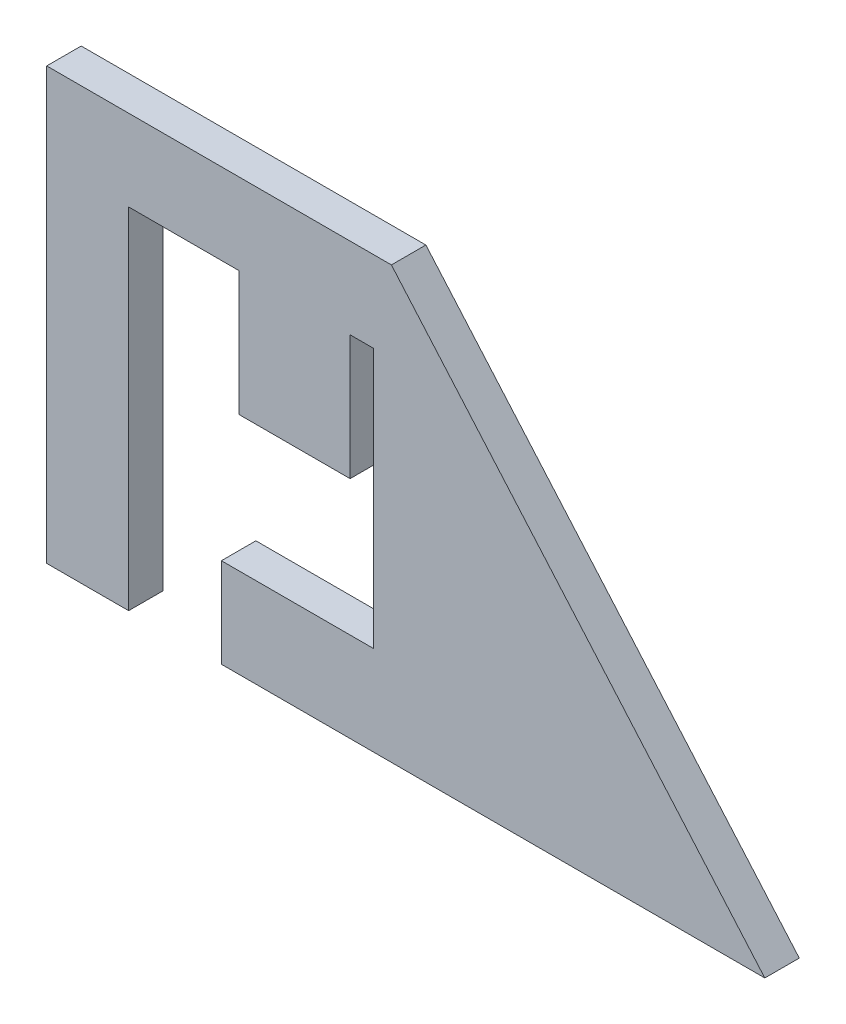
ISO-10303-21;
HEADER;
FILE_DESCRIPTION(('STEP AP214'),'2;1');
FILE_NAME('part.step','',(''),(''),'','','');
FILE_SCHEMA(('AUTOMOTIVE_DESIGN { 1 0 10303 214 1 1 1 1 }'));
ENDSEC;
DATA;
#1=APPLICATION_CONTEXT('core data for automotive mechanical design processes');
#2=APPLICATION_PROTOCOL_DEFINITION('international standard','automotive_design',2000,#1);
#3=PRODUCT_CONTEXT('',#1,'mechanical');
#4=PRODUCT('Part','Part','',(#3));
#5=PRODUCT_RELATED_PRODUCT_CATEGORY('part','',(#4));
#6=PRODUCT_DEFINITION_FORMATION('','',#4);
#7=PRODUCT_DEFINITION_CONTEXT('part definition',#1,'design');
#8=PRODUCT_DEFINITION('design','',#6,#7);
#9=PRODUCT_DEFINITION_SHAPE('','',#8);
#10=(LENGTH_UNIT() NAMED_UNIT(*) SI_UNIT(.MILLI.,.METRE.));
#11=(NAMED_UNIT(*) PLANE_ANGLE_UNIT() SI_UNIT($,.RADIAN.));
#12=(NAMED_UNIT(*) SI_UNIT($,.STERADIAN.) SOLID_ANGLE_UNIT());
#13=UNCERTAINTY_MEASURE_WITH_UNIT(LENGTH_MEASURE(1.E-05),#10,'distance_accuracy_value','');
#14=(GEOMETRIC_REPRESENTATION_CONTEXT(3) GLOBAL_UNCERTAINTY_ASSIGNED_CONTEXT((#13)) GLOBAL_UNIT_ASSIGNED_CONTEXT((#10,
#11,#12)) REPRESENTATION_CONTEXT('',''));
#15=CARTESIAN_POINT('',(0.,0.,0.));
#16=DIRECTION('',(0.,0.,1.));
#17=DIRECTION('',(1.,0.,0.));
#18=AXIS2_PLACEMENT_3D('',#15,#16,#17);
#19=CARTESIAN_POINT('',(0.,0.,6.));
#20=DIRECTION('',(0.,1.,0.));
#21=DIRECTION('',(0.,0.,1.));
#22=AXIS2_PLACEMENT_3D('',#19,#20,#21);
#23=PLANE('',#22);
#24=DIRECTION('',(1.,0.,0.));
#25=VECTOR('',#24,1.);
#26=CARTESIAN_POINT('',(0.,0.,6.));
#27=LINE('',#26,#25);
#28=CARTESIAN_POINT('',(60.8165102830287,0.,6.));
#29=VERTEX_POINT('',#28);
#30=CARTESIAN_POINT('',(250.,0.,6.));
#31=VERTEX_POINT('',#30);
#32=EDGE_CURVE('E232',#29,#31,#27,.T.);
#33=ORIENTED_EDGE('',*,*,#32,.F.);
#34=DIRECTION('',(0.,0.,1.));
#35=VECTOR('',#34,1.);
#36=CARTESIAN_POINT('',(60.8165102830287,0.,-6.));
#37=LINE('',#36,#35);
#38=CARTESIAN_POINT('',(60.8165102830287,0.,-6.));
#39=VERTEX_POINT('',#38);
#40=EDGE_CURVE('E216',#39,#29,#37,.T.);
#41=ORIENTED_EDGE('',*,*,#40,.F.);
#42=DIRECTION('',(1.,0.,0.));
#43=VECTOR('',#42,1.);
#44=CARTESIAN_POINT('',(0.,0.,-6.));
#45=LINE('',#44,#43);
#46=CARTESIAN_POINT('',(250.,0.,-6.));
#47=VERTEX_POINT('',#46);
#48=EDGE_CURVE('E221',#39,#47,#45,.T.);
#49=ORIENTED_EDGE('',*,*,#48,.T.);
#50=DIRECTION('',(0.,0.,-1.));
#51=VECTOR('',#50,1.);
#52=CARTESIAN_POINT('',(250.,0.,6.));
#53=LINE('',#52,#51);
#54=EDGE_CURVE('E43',#31,#47,#53,.T.);
#55=ORIENTED_EDGE('',*,*,#54,.F.);
#56=EDGE_LOOP('',(#33,#41,#49,#55));
#57=FACE_BOUND('',#56,.T.);
#58=ADVANCED_FACE('F35',(#57),#23,.F.);
#59=CARTESIAN_POINT('',(0.,150.,6.));
#60=DIRECTION('',(1.,0.,0.));
#61=DIRECTION('',(0.,1.,0.));
#62=AXIS2_PLACEMENT_3D('',#59,#60,#61);
#63=PLANE('',#62);
#64=DIRECTION('',(0.,0.,-1.));
#65=VECTOR('',#64,1.);
#66=CARTESIAN_POINT('',(0.,150.,6.));
#67=LINE('',#66,#65);
#68=CARTESIAN_POINT('',(0.,150.,6.));
#69=VERTEX_POINT('',#68);
#70=CARTESIAN_POINT('',(0.,150.,-6.));
#71=VERTEX_POINT('',#70);
#72=EDGE_CURVE('E239',#69,#71,#67,.T.);
#73=ORIENTED_EDGE('',*,*,#72,.T.);
#74=DIRECTION('',(0.,-1.,0.));
#75=VECTOR('',#74,1.);
#76=CARTESIAN_POINT('',(0.,150.,-6.));
#77=LINE('',#76,#75);
#78=CARTESIAN_POINT('',(0.,0.,-6.));
#79=VERTEX_POINT('',#78);
#80=EDGE_CURVE('E203',#71,#79,#77,.T.);
#81=ORIENTED_EDGE('',*,*,#80,.T.);
#82=DIRECTION('',(0.,0.,-1.));
#83=VECTOR('',#82,1.);
#84=CARTESIAN_POINT('',(0.,0.,6.));
#85=LINE('',#84,#83);
#86=CARTESIAN_POINT('',(0.,0.,6.));
#87=VERTEX_POINT('',#86);
#88=EDGE_CURVE('E11',#87,#79,#85,.T.);
#89=ORIENTED_EDGE('',*,*,#88,.F.);
#90=DIRECTION('',(0.,-1.,0.));
#91=VECTOR('',#90,1.);
#92=CARTESIAN_POINT('',(0.,150.,6.));
#93=LINE('',#92,#91);
#94=EDGE_CURVE('E230',#69,#87,#93,.T.);
#95=ORIENTED_EDGE('',*,*,#94,.F.);
#96=EDGE_LOOP('',(#73,#81,#89,#95));
#97=FACE_BOUND('',#96,.T.);
#98=ADVANCED_FACE('F37',(#97),#63,.F.);
#99=CARTESIAN_POINT('',(28.5158073225923,0.,-6.));
#100=VERTEX_POINT('',#99);
#101=EDGE_CURVE('E222',#79,#100,#45,.T.);
#102=ORIENTED_EDGE('',*,*,#101,.T.);
#103=DIRECTION('',(0.,0.,1.));
#104=VECTOR('',#103,1.);
#105=CARTESIAN_POINT('',(28.5158073225923,0.,-6.));
#106=LINE('',#105,#104);
#107=CARTESIAN_POINT('',(28.5158073225923,0.,6.));
#108=VERTEX_POINT('',#107);
#109=EDGE_CURVE('E50',#100,#108,#106,.T.);
#110=ORIENTED_EDGE('',*,*,#109,.T.);
#111=EDGE_CURVE('E233',#87,#108,#27,.T.);
#112=ORIENTED_EDGE('',*,*,#111,.F.);
#113=ORIENTED_EDGE('',*,*,#88,.T.);
#114=EDGE_LOOP('',(#102,#110,#112,#113));
#115=FACE_BOUND('',#114,.T.);
#116=ADVANCED_FACE('F261',(#115),#23,.F.);
#117=CARTESIAN_POINT('',(250.,0.,6.));
#118=DIRECTION('',(-0.755689082789817,-0.654930538417842,0.));
#119=DIRECTION('',(0.654930538417842,-0.755689082789818,0.));
#120=AXIS2_PLACEMENT_3D('',#117,#118,#119);
#121=PLANE('',#120);
#122=ORIENTED_EDGE('',*,*,#54,.T.);
#123=DIRECTION('',(-0.654930538417842,0.755689082789818,0.));
#124=VECTOR('',#123,1.);
#125=CARTESIAN_POINT('',(250.,0.,-6.));
#126=LINE('',#125,#124);
#127=CARTESIAN_POINT('',(120.,150.,-6.));
#128=VERTEX_POINT('',#127);
#129=EDGE_CURVE('E224',#47,#128,#126,.T.);
#130=ORIENTED_EDGE('',*,*,#129,.T.);
#131=DIRECTION('',(0.,0.,-1.));
#132=VECTOR('',#131,1.);
#133=CARTESIAN_POINT('',(120.,150.,6.));
#134=LINE('',#133,#132);
#135=CARTESIAN_POINT('',(120.,150.,6.));
#136=VERTEX_POINT('',#135);
#137=EDGE_CURVE('E241',#136,#128,#134,.T.);
#138=ORIENTED_EDGE('',*,*,#137,.F.);
#139=DIRECTION('',(-0.654930538417842,0.755689082789818,0.));
#140=VECTOR('',#139,1.);
#141=CARTESIAN_POINT('',(250.,0.,6.));
#142=LINE('',#141,#140);
#143=EDGE_CURVE('E236',#31,#136,#142,.T.);
#144=ORIENTED_EDGE('',*,*,#143,.F.);
#145=EDGE_LOOP('',(#122,#130,#138,#144));
#146=FACE_BOUND('',#145,.T.);
#147=ADVANCED_FACE('F247',(#146),#121,.F.);
#148=CARTESIAN_POINT('',(120.,150.,6.));
#149=DIRECTION('',(0.,-1.,0.));
#150=DIRECTION('',(1.,0.,0.));
#151=AXIS2_PLACEMENT_3D('',#148,#149,#150);
#152=PLANE('',#151);
#153=ORIENTED_EDGE('',*,*,#137,.T.);
#154=DIRECTION('',(-1.,0.,0.));
#155=VECTOR('',#154,1.);
#156=CARTESIAN_POINT('',(120.,150.,-6.));
#157=LINE('',#156,#155);
#158=EDGE_CURVE('E227',#128,#71,#157,.T.);
#159=ORIENTED_EDGE('',*,*,#158,.T.);
#160=ORIENTED_EDGE('',*,*,#72,.F.);
#161=DIRECTION('',(-1.,0.,0.));
#162=VECTOR('',#161,1.);
#163=CARTESIAN_POINT('',(120.,150.,6.));
#164=LINE('',#163,#162);
#165=EDGE_CURVE('E58',#136,#69,#164,.T.);
#166=ORIENTED_EDGE('',*,*,#165,.F.);
#167=EDGE_LOOP('',(#153,#159,#160,#166));
#168=FACE_BOUND('',#167,.T.);
#169=ADVANCED_FACE('F254',(#168),#152,.F.);
#170=CARTESIAN_POINT('',(0.,0.,6.));
#171=DIRECTION('',(0.,0.,1.));
#172=DIRECTION('',(1.,0.,0.));
#173=AXIS2_PLACEMENT_3D('',#170,#171,#172);
#174=PLANE('',#173);
#175=DIRECTION('',(0.,1.,0.));
#176=VECTOR('',#175,1.);
#177=CARTESIAN_POINT('',(60.8165102830287,31.2245087549701,6.));
#178=LINE('',#177,#176);
#179=CARTESIAN_POINT('',(60.8165102830287,31.2245087549701,6.));
#180=VERTEX_POINT('',#179);
#181=EDGE_CURVE('E184',#29,#180,#178,.T.);
#182=ORIENTED_EDGE('',*,*,#181,.F.);
#183=ORIENTED_EDGE('',*,*,#32,.T.);
#184=ORIENTED_EDGE('',*,*,#143,.T.);
#185=ORIENTED_EDGE('',*,*,#165,.T.);
#186=ORIENTED_EDGE('',*,*,#94,.T.);
#187=ORIENTED_EDGE('',*,*,#111,.T.);
#188=DIRECTION('',(0.,-1.,0.));
#189=VECTOR('',#188,1.);
#190=CARTESIAN_POINT('',(28.5158073225923,0.,6.));
#191=LINE('',#190,#189);
#192=CARTESIAN_POINT('',(28.5158073225923,121.742691755025,6.));
#193=VERTEX_POINT('',#192);
#194=EDGE_CURVE('E182',#193,#108,#191,.T.);
#195=ORIENTED_EDGE('',*,*,#194,.F.);
#196=DIRECTION('',(-1.,0.,0.));
#197=VECTOR('',#196,1.);
#198=CARTESIAN_POINT('',(28.5158073225923,121.742691755025,6.));
#199=LINE('',#198,#197);
#200=CARTESIAN_POINT('',(67.0124310238046,121.742691755025,6.));
#201=VERTEX_POINT('',#200);
#202=EDGE_CURVE('E143',#201,#193,#199,.T.);
#203=ORIENTED_EDGE('',*,*,#202,.F.);
#204=DIRECTION('',(0.,1.,0.));
#205=VECTOR('',#204,1.);
#206=CARTESIAN_POINT('',(67.0124310238046,121.742691755025,6.));
#207=LINE('',#206,#205);
#208=CARTESIAN_POINT('',(67.0124310238046,78.3646518797329,6.));
#209=VERTEX_POINT('',#208);
#210=EDGE_CURVE('E158',#209,#201,#207,.T.);
#211=ORIENTED_EDGE('',*,*,#210,.F.);
#212=DIRECTION('',(-1.,0.,0.));
#213=VECTOR('',#212,1.);
#214=CARTESIAN_POINT('',(67.0124310238046,78.3646518797329,6.));
#215=LINE('',#214,#213);
#216=CARTESIAN_POINT('',(105.623269970229,78.3646518797329,6.));
#217=VERTEX_POINT('',#216);
#218=EDGE_CURVE('E161',#217,#209,#215,.T.);
#219=ORIENTED_EDGE('',*,*,#218,.F.);
#220=DIRECTION('',(0.,-1.,0.));
#221=VECTOR('',#220,1.);
#222=CARTESIAN_POINT('',(105.623269970229,78.3646518797329,6.));
#223=LINE('',#222,#221);
#224=CARTESIAN_POINT('',(105.623269970229,121.742691755025,6.));
#225=VERTEX_POINT('',#224);
#226=EDGE_CURVE('E196',#225,#217,#223,.T.);
#227=ORIENTED_EDGE('',*,*,#226,.F.);
#228=DIRECTION('',(-1.,0.,0.));
#229=VECTOR('',#228,1.);
#230=CARTESIAN_POINT('',(105.623269970229,121.742691755025,6.));
#231=LINE('',#230,#229);
#232=CARTESIAN_POINT('',(113.724056309674,121.742691755025,6.));
#233=VERTEX_POINT('',#232);
#234=EDGE_CURVE('E193',#233,#225,#231,.T.);
#235=ORIENTED_EDGE('',*,*,#234,.F.);
#236=DIRECTION('',(0.,1.,0.));
#237=VECTOR('',#236,1.);
#238=CARTESIAN_POINT('',(113.724056309674,121.742691755025,6.));
#239=LINE('',#238,#237);
#240=CARTESIAN_POINT('',(113.724056309674,31.2245087549701,6.));
#241=VERTEX_POINT('',#240);
#242=EDGE_CURVE('E190',#241,#233,#239,.T.);
#243=ORIENTED_EDGE('',*,*,#242,.F.);
#244=DIRECTION('',(1.,0.,0.));
#245=VECTOR('',#244,1.);
#246=CARTESIAN_POINT('',(113.724056309674,31.2245087549701,6.));
#247=LINE('',#246,#245);
#248=EDGE_CURVE('E187',#180,#241,#247,.T.);
#249=ORIENTED_EDGE('',*,*,#248,.F.);
#250=EDGE_LOOP('',(#182,#183,#184,#185,#186,#187,#195,#203,#211,#219,#227,#235,#243,#249));
#251=FACE_BOUND('',#250,.T.);
#252=ADVANCED_FACE('F259',(#251),#174,.T.);
#253=CARTESIAN_POINT('',(0.,0.,-6.));
#254=DIRECTION('',(0.,0.,1.));
#255=DIRECTION('',(1.,0.,0.));
#256=AXIS2_PLACEMENT_3D('',#253,#254,#255);
#257=PLANE('',#256);
#258=ORIENTED_EDGE('',*,*,#48,.F.);
#259=DIRECTION('',(0.,1.,0.));
#260=VECTOR('',#259,1.);
#261=CARTESIAN_POINT('',(60.8165102830287,31.2245087549701,-6.));
#262=LINE('',#261,#260);
#263=CARTESIAN_POINT('',(60.8165102830287,31.2245087549701,-6.));
#264=VERTEX_POINT('',#263);
#265=EDGE_CURVE('E152',#39,#264,#262,.T.);
#266=ORIENTED_EDGE('',*,*,#265,.T.);
#267=DIRECTION('',(1.,0.,0.));
#268=VECTOR('',#267,1.);
#269=CARTESIAN_POINT('',(113.724056309674,31.2245087549701,-6.));
#270=LINE('',#269,#268);
#271=CARTESIAN_POINT('',(113.724056309674,31.2245087549701,-6.));
#272=VERTEX_POINT('',#271);
#273=EDGE_CURVE('E166',#264,#272,#270,.T.);
#274=ORIENTED_EDGE('',*,*,#273,.T.);
#275=DIRECTION('',(0.,1.,0.));
#276=VECTOR('',#275,1.);
#277=CARTESIAN_POINT('',(113.724056309674,121.742691755025,-6.));
#278=LINE('',#277,#276);
#279=CARTESIAN_POINT('',(113.724056309674,121.742691755025,-6.));
#280=VERTEX_POINT('',#279);
#281=EDGE_CURVE('E169',#272,#280,#278,.T.);
#282=ORIENTED_EDGE('',*,*,#281,.T.);
#283=DIRECTION('',(-1.,0.,0.));
#284=VECTOR('',#283,1.);
#285=CARTESIAN_POINT('',(105.623269970229,121.742691755025,-6.));
#286=LINE('',#285,#284);
#287=CARTESIAN_POINT('',(105.623269970229,121.742691755025,-6.));
#288=VERTEX_POINT('',#287);
#289=EDGE_CURVE('E172',#280,#288,#286,.T.);
#290=ORIENTED_EDGE('',*,*,#289,.T.);
#291=DIRECTION('',(0.,-1.,0.));
#292=VECTOR('',#291,1.);
#293=CARTESIAN_POINT('',(105.623269970229,78.3646518797329,-6.));
#294=LINE('',#293,#292);
#295=CARTESIAN_POINT('',(105.623269970229,78.3646518797329,-6.));
#296=VERTEX_POINT('',#295);
#297=EDGE_CURVE('E175',#288,#296,#294,.T.);
#298=ORIENTED_EDGE('',*,*,#297,.T.);
#299=DIRECTION('',(-1.,0.,0.));
#300=VECTOR('',#299,1.);
#301=CARTESIAN_POINT('',(67.0124310238046,78.3646518797329,-6.));
#302=LINE('',#301,#300);
#303=CARTESIAN_POINT('',(67.0124310238046,78.3646518797329,-6.));
#304=VERTEX_POINT('',#303);
#305=EDGE_CURVE('E178',#296,#304,#302,.T.);
#306=ORIENTED_EDGE('',*,*,#305,.T.);
#307=DIRECTION('',(0.,1.,0.));
#308=VECTOR('',#307,1.);
#309=CARTESIAN_POINT('',(67.0124310238046,121.742691755025,-6.));
#310=LINE('',#309,#308);
#311=CARTESIAN_POINT('',(67.0124310238046,121.742691755025,-6.));
#312=VERTEX_POINT('',#311);
#313=EDGE_CURVE('E145',#304,#312,#310,.T.);
#314=ORIENTED_EDGE('',*,*,#313,.T.);
#315=DIRECTION('',(-1.,0.,0.));
#316=VECTOR('',#315,1.);
#317=CARTESIAN_POINT('',(28.5158073225923,121.742691755025,-6.));
#318=LINE('',#317,#316);
#319=CARTESIAN_POINT('',(28.5158073225923,121.742691755025,-6.));
#320=VERTEX_POINT('',#319);
#321=EDGE_CURVE('E140',#312,#320,#318,.T.);
#322=ORIENTED_EDGE('',*,*,#321,.T.);
#323=DIRECTION('',(0.,-1.,0.));
#324=VECTOR('',#323,1.);
#325=CARTESIAN_POINT('',(28.5158073225923,0.,-6.));
#326=LINE('',#325,#324);
#327=EDGE_CURVE('E147',#320,#100,#326,.T.);
#328=ORIENTED_EDGE('',*,*,#327,.T.);
#329=ORIENTED_EDGE('',*,*,#101,.F.);
#330=ORIENTED_EDGE('',*,*,#80,.F.);
#331=ORIENTED_EDGE('',*,*,#158,.F.);
#332=ORIENTED_EDGE('',*,*,#129,.F.);
#333=EDGE_LOOP('',(#258,#266,#274,#282,#290,#298,#306,#314,#322,#328,#329,#330,#331,#332));
#334=FACE_BOUND('',#333,.T.);
#335=ADVANCED_FACE('F155',(#334),#257,.F.);
#336=CARTESIAN_POINT('',(28.5158073225923,121.742691755025,-6.));
#337=DIRECTION('',(0.,1.,0.));
#338=DIRECTION('',(0.,0.,1.));
#339=AXIS2_PLACEMENT_3D('',#336,#337,#338);
#340=PLANE('',#339);
#341=ORIENTED_EDGE('',*,*,#202,.T.);
#342=DIRECTION('',(0.,0.,1.));
#343=VECTOR('',#342,1.);
#344=CARTESIAN_POINT('',(28.5158073225923,121.742691755025,-6.));
#345=LINE('',#344,#343);
#346=EDGE_CURVE('E137',#320,#193,#345,.T.);
#347=ORIENTED_EDGE('',*,*,#346,.F.);
#348=ORIENTED_EDGE('',*,*,#321,.F.);
#349=DIRECTION('',(0.,0.,1.));
#350=VECTOR('',#349,1.);
#351=CARTESIAN_POINT('',(67.0124310238046,121.742691755025,-6.));
#352=LINE('',#351,#350);
#353=EDGE_CURVE('E201',#312,#201,#352,.T.);
#354=ORIENTED_EDGE('',*,*,#353,.T.);
#355=EDGE_LOOP('',(#341,#347,#348,#354));
#356=FACE_BOUND('',#355,.T.);
#357=ADVANCED_FACE('F138',(#356),#340,.F.);
#358=CARTESIAN_POINT('',(67.0124310238046,121.742691755025,-6.));
#359=DIRECTION('',(1.,0.,0.));
#360=DIRECTION('',(0.,0.,-1.));
#361=AXIS2_PLACEMENT_3D('',#358,#359,#360);
#362=PLANE('',#361);
#363=ORIENTED_EDGE('',*,*,#210,.T.);
#364=ORIENTED_EDGE('',*,*,#353,.F.);
#365=ORIENTED_EDGE('',*,*,#313,.F.);
#366=DIRECTION('',(0.,0.,1.));
#367=VECTOR('',#366,1.);
#368=CARTESIAN_POINT('',(67.0124310238046,78.3646518797329,-6.));
#369=LINE('',#368,#367);
#370=EDGE_CURVE('E204',#304,#209,#369,.T.);
#371=ORIENTED_EDGE('',*,*,#370,.T.);
#372=EDGE_LOOP('',(#363,#364,#365,#371));
#373=FACE_BOUND('',#372,.T.);
#374=ADVANCED_FACE('F298',(#373),#362,.F.);
#375=CARTESIAN_POINT('',(67.0124310238046,78.3646518797329,-6.));
#376=DIRECTION('',(0.,1.,0.));
#377=DIRECTION('',(0.,0.,1.));
#378=AXIS2_PLACEMENT_3D('',#375,#376,#377);
#379=PLANE('',#378);
#380=ORIENTED_EDGE('',*,*,#218,.T.);
#381=ORIENTED_EDGE('',*,*,#370,.F.);
#382=ORIENTED_EDGE('',*,*,#305,.F.);
#383=DIRECTION('',(0.,0.,1.));
#384=VECTOR('',#383,1.);
#385=CARTESIAN_POINT('',(105.623269970229,78.3646518797329,-6.));
#386=LINE('',#385,#384);
#387=EDGE_CURVE('E206',#296,#217,#386,.T.);
#388=ORIENTED_EDGE('',*,*,#387,.T.);
#389=EDGE_LOOP('',(#380,#381,#382,#388));
#390=FACE_BOUND('',#389,.T.);
#391=ADVANCED_FACE('F295',(#390),#379,.F.);
#392=CARTESIAN_POINT('',(105.623269970229,78.3646518797329,-6.));
#393=DIRECTION('',(-1.,0.,0.));
#394=DIRECTION('',(0.,0.,1.));
#395=AXIS2_PLACEMENT_3D('',#392,#393,#394);
#396=PLANE('',#395);
#397=ORIENTED_EDGE('',*,*,#226,.T.);
#398=ORIENTED_EDGE('',*,*,#387,.F.);
#399=ORIENTED_EDGE('',*,*,#297,.F.);
#400=DIRECTION('',(0.,0.,1.));
#401=VECTOR('',#400,1.);
#402=CARTESIAN_POINT('',(105.623269970229,121.742691755025,-6.));
#403=LINE('',#402,#401);
#404=EDGE_CURVE('E208',#288,#225,#403,.T.);
#405=ORIENTED_EDGE('',*,*,#404,.T.);
#406=EDGE_LOOP('',(#397,#398,#399,#405));
#407=FACE_BOUND('',#406,.T.);
#408=ADVANCED_FACE('F291',(#407),#396,.F.);
#409=CARTESIAN_POINT('',(105.623269970229,121.742691755025,-6.));
#410=DIRECTION('',(0.,1.,0.));
#411=DIRECTION('',(0.,0.,1.));
#412=AXIS2_PLACEMENT_3D('',#409,#410,#411);
#413=PLANE('',#412);
#414=ORIENTED_EDGE('',*,*,#234,.T.);
#415=ORIENTED_EDGE('',*,*,#404,.F.);
#416=ORIENTED_EDGE('',*,*,#289,.F.);
#417=DIRECTION('',(0.,0.,1.));
#418=VECTOR('',#417,1.);
#419=CARTESIAN_POINT('',(113.724056309674,121.742691755025,-6.));
#420=LINE('',#419,#418);
#421=EDGE_CURVE('E210',#280,#233,#420,.T.);
#422=ORIENTED_EDGE('',*,*,#421,.T.);
#423=EDGE_LOOP('',(#414,#415,#416,#422));
#424=FACE_BOUND('',#423,.T.);
#425=ADVANCED_FACE('F287',(#424),#413,.F.);
#426=CARTESIAN_POINT('',(113.724056309674,121.742691755025,-6.));
#427=DIRECTION('',(1.,0.,0.));
#428=DIRECTION('',(0.,0.,-1.));
#429=AXIS2_PLACEMENT_3D('',#426,#427,#428);
#430=PLANE('',#429);
#431=ORIENTED_EDGE('',*,*,#242,.T.);
#432=ORIENTED_EDGE('',*,*,#421,.F.);
#433=ORIENTED_EDGE('',*,*,#281,.F.);
#434=DIRECTION('',(0.,0.,1.));
#435=VECTOR('',#434,1.);
#436=CARTESIAN_POINT('',(113.724056309674,31.2245087549701,-6.));
#437=LINE('',#436,#435);
#438=EDGE_CURVE('E212',#272,#241,#437,.T.);
#439=ORIENTED_EDGE('',*,*,#438,.T.);
#440=EDGE_LOOP('',(#431,#432,#433,#439));
#441=FACE_BOUND('',#440,.T.);
#442=ADVANCED_FACE('F283',(#441),#430,.F.);
#443=CARTESIAN_POINT('',(113.724056309674,31.2245087549701,-6.));
#444=DIRECTION('',(0.,-1.,0.));
#445=DIRECTION('',(0.,0.,-1.));
#446=AXIS2_PLACEMENT_3D('',#443,#444,#445);
#447=PLANE('',#446);
#448=ORIENTED_EDGE('',*,*,#248,.T.);
#449=ORIENTED_EDGE('',*,*,#438,.F.);
#450=ORIENTED_EDGE('',*,*,#273,.F.);
#451=DIRECTION('',(0.,0.,1.));
#452=VECTOR('',#451,1.);
#453=CARTESIAN_POINT('',(60.8165102830287,31.2245087549701,-6.));
#454=LINE('',#453,#452);
#455=EDGE_CURVE('E214',#264,#180,#454,.T.);
#456=ORIENTED_EDGE('',*,*,#455,.T.);
#457=EDGE_LOOP('',(#448,#449,#450,#456));
#458=FACE_BOUND('',#457,.T.);
#459=ADVANCED_FACE('F281',(#458),#447,.F.);
#460=CARTESIAN_POINT('',(60.8165102830287,31.2245087549701,-6.));
#461=DIRECTION('',(1.,0.,0.));
#462=DIRECTION('',(0.,0.,-1.));
#463=AXIS2_PLACEMENT_3D('',#460,#461,#462);
#464=PLANE('',#463);
#465=ORIENTED_EDGE('',*,*,#181,.T.);
#466=ORIENTED_EDGE('',*,*,#455,.F.);
#467=ORIENTED_EDGE('',*,*,#265,.F.);
#468=ORIENTED_EDGE('',*,*,#40,.T.);
#469=EDGE_LOOP('',(#465,#466,#467,#468));
#470=FACE_BOUND('',#469,.T.);
#471=ADVANCED_FACE('F277',(#470),#464,.F.);
#472=CARTESIAN_POINT('',(28.5158073225923,0.,-6.));
#473=DIRECTION('',(-1.,0.,0.));
#474=DIRECTION('',(0.,0.,1.));
#475=AXIS2_PLACEMENT_3D('',#472,#473,#474);
#476=PLANE('',#475);
#477=ORIENTED_EDGE('',*,*,#194,.T.);
#478=ORIENTED_EDGE('',*,*,#109,.F.);
#479=ORIENTED_EDGE('',*,*,#327,.F.);
#480=ORIENTED_EDGE('',*,*,#346,.T.);
#481=EDGE_LOOP('',(#477,#478,#479,#480));
#482=FACE_BOUND('',#481,.T.);
#483=ADVANCED_FACE('F148',(#482),#476,.F.);
#484=CLOSED_SHELL('',(#58,#98,#116,#147,#169,#252,#335,#357,#374,#391,#408,#425,#442,#459,#471,#483));
#485=MANIFOLD_SOLID_BREP('B2',#484);
#486=ADVANCED_BREP_SHAPE_REPRESENTATION('',(#18,#485),#14);
#487=SHAPE_DEFINITION_REPRESENTATION(#9,#486);
ENDSEC;
END-ISO-10303-21;
